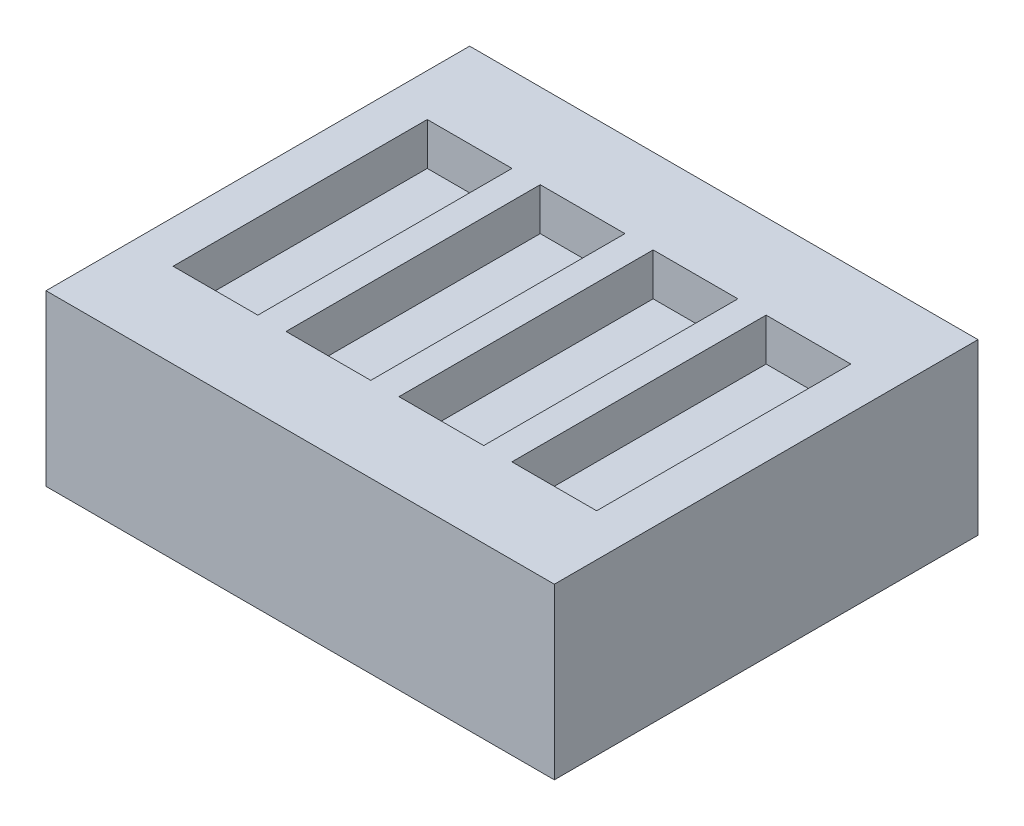
ISO-10303-21;
HEADER;
FILE_DESCRIPTION(('STEP AP214'),'2;1');
FILE_NAME('part.step','',(''),(''),'','','');
FILE_SCHEMA(('AUTOMOTIVE_DESIGN { 1 0 10303 214 1 1 1 1 }'));
ENDSEC;
DATA;
#1=APPLICATION_CONTEXT('core data for automotive mechanical design processes');
#2=APPLICATION_PROTOCOL_DEFINITION('international standard','automotive_design',2000,#1);
#3=PRODUCT_CONTEXT('',#1,'mechanical');
#4=PRODUCT('Part','Part','',(#3));
#5=PRODUCT_RELATED_PRODUCT_CATEGORY('part','',(#4));
#6=PRODUCT_DEFINITION_FORMATION('','',#4);
#7=PRODUCT_DEFINITION_CONTEXT('part definition',#1,'design');
#8=PRODUCT_DEFINITION('design','',#6,#7);
#9=PRODUCT_DEFINITION_SHAPE('','',#8);
#10=(LENGTH_UNIT() NAMED_UNIT(*) SI_UNIT(.MILLI.,.METRE.));
#11=(NAMED_UNIT(*) PLANE_ANGLE_UNIT() SI_UNIT($,.RADIAN.));
#12=(NAMED_UNIT(*) SI_UNIT($,.STERADIAN.) SOLID_ANGLE_UNIT());
#13=UNCERTAINTY_MEASURE_WITH_UNIT(LENGTH_MEASURE(1.E-05),#10,'distance_accuracy_value','');
#14=(GEOMETRIC_REPRESENTATION_CONTEXT(3) GLOBAL_UNCERTAINTY_ASSIGNED_CONTEXT((#13)) GLOBAL_UNIT_ASSIGNED_CONTEXT((#10,
#11,#12)) REPRESENTATION_CONTEXT('',''));
#15=CARTESIAN_POINT('',(0.,0.,0.));
#16=DIRECTION('',(0.,0.,1.));
#17=DIRECTION('',(1.,0.,0.));
#18=AXIS2_PLACEMENT_3D('',#15,#16,#17);
#19=CARTESIAN_POINT('',(0.,2.,0.));
#20=DIRECTION('',(0.,-1.,0.));
#21=DIRECTION('',(0.,0.,-1.));
#22=AXIS2_PLACEMENT_3D('',#19,#20,#21);
#23=PLANE('',#22);
#24=DIRECTION('',(0.,0.,1.));
#25=VECTOR('',#24,1.);
#26=CARTESIAN_POINT('',(1.5,2.,-4.));
#27=LINE('',#26,#25);
#28=CARTESIAN_POINT('',(1.5,2.,-4.));
#29=VERTEX_POINT('',#28);
#30=CARTESIAN_POINT('',(1.5,2.,-1.));
#31=VERTEX_POINT('',#30);
#32=EDGE_CURVE('E206',#29,#31,#27,.T.);
#33=ORIENTED_EDGE('',*,*,#32,.T.);
#34=DIRECTION('',(1.,0.,0.));
#35=VECTOR('',#34,1.);
#36=CARTESIAN_POINT('',(0.5,2.,-1.));
#37=LINE('',#36,#35);
#38=CARTESIAN_POINT('',(0.5,2.,-1.));
#39=VERTEX_POINT('',#38);
#40=EDGE_CURVE('E54',#39,#31,#37,.T.);
#41=ORIENTED_EDGE('',*,*,#40,.F.);
#42=DIRECTION('',(0.,0.,1.));
#43=VECTOR('',#42,1.);
#44=CARTESIAN_POINT('',(0.5,2.,-4.));
#45=LINE('',#44,#43);
#46=CARTESIAN_POINT('',(0.5,2.,-4.));
#47=VERTEX_POINT('',#46);
#48=EDGE_CURVE('E197',#47,#39,#45,.T.);
#49=ORIENTED_EDGE('',*,*,#48,.F.);
#50=DIRECTION('',(1.,0.,0.));
#51=VECTOR('',#50,1.);
#52=CARTESIAN_POINT('',(0.5,2.,-4.));
#53=LINE('',#52,#51);
#54=EDGE_CURVE('E200',#47,#29,#53,.T.);
#55=ORIENTED_EDGE('',*,*,#54,.T.);
#56=EDGE_LOOP('',(#33,#41,#49,#55));
#57=FACE_BOUND('',#56,.T.);
#58=DIRECTION('',(1.,0.,0.));
#59=VECTOR('',#58,1.);
#60=CARTESIAN_POINT('',(3.166,2.,-4.));
#61=LINE('',#60,#59);
#62=CARTESIAN_POINT('',(3.166,2.,-4.));
#63=VERTEX_POINT('',#62);
#64=CARTESIAN_POINT('',(4.166,2.,-4.));
#65=VERTEX_POINT('',#64);
#66=EDGE_CURVE('E219',#63,#65,#61,.T.);
#67=ORIENTED_EDGE('',*,*,#66,.T.);
#68=DIRECTION('',(0.,0.,1.));
#69=VECTOR('',#68,1.);
#70=CARTESIAN_POINT('',(4.166,2.,-4.));
#71=LINE('',#70,#69);
#72=CARTESIAN_POINT('',(4.166,2.,-1.));
#73=VERTEX_POINT('',#72);
#74=EDGE_CURVE('E265',#65,#73,#71,.T.);
#75=ORIENTED_EDGE('',*,*,#74,.T.);
#76=DIRECTION('',(1.,0.,0.));
#77=VECTOR('',#76,1.);
#78=CARTESIAN_POINT('',(3.166,2.,-1.));
#79=LINE('',#78,#77);
#80=CARTESIAN_POINT('',(3.166,2.,-1.));
#81=VERTEX_POINT('',#80);
#82=EDGE_CURVE('E261',#81,#73,#79,.T.);
#83=ORIENTED_EDGE('',*,*,#82,.F.);
#84=DIRECTION('',(0.,0.,1.));
#85=VECTOR('',#84,1.);
#86=CARTESIAN_POINT('',(3.166,2.,-4.));
#87=LINE('',#86,#85);
#88=EDGE_CURVE('E258',#63,#81,#87,.T.);
#89=ORIENTED_EDGE('',*,*,#88,.F.);
#90=EDGE_LOOP('',(#67,#75,#83,#89));
#91=FACE_BOUND('',#90,.T.);
#92=DIRECTION('',(0.,0.,1.));
#93=VECTOR('',#92,1.);
#94=CARTESIAN_POINT('',(0.,2.,0.));
#95=LINE('',#94,#93);
#96=CARTESIAN_POINT('',(0.,2.,-5.));
#97=VERTEX_POINT('',#96);
#98=CARTESIAN_POINT('',(0.,2.,0.));
#99=VERTEX_POINT('',#98);
#100=EDGE_CURVE('E311',#97,#99,#95,.T.);
#101=ORIENTED_EDGE('',*,*,#100,.T.);
#102=DIRECTION('',(1.,0.,0.));
#103=VECTOR('',#102,1.);
#104=CARTESIAN_POINT('',(0.,2.,0.));
#105=LINE('',#104,#103);
#106=CARTESIAN_POINT('',(6.,2.,0.));
#107=VERTEX_POINT('',#106);
#108=EDGE_CURVE('E314',#99,#107,#105,.T.);
#109=ORIENTED_EDGE('',*,*,#108,.T.);
#110=DIRECTION('',(0.,0.,-1.));
#111=VECTOR('',#110,1.);
#112=CARTESIAN_POINT('',(6.,2.,0.));
#113=LINE('',#112,#111);
#114=CARTESIAN_POINT('',(6.,2.,-5.));
#115=VERTEX_POINT('',#114);
#116=EDGE_CURVE('E317',#107,#115,#113,.T.);
#117=ORIENTED_EDGE('',*,*,#116,.T.);
#118=DIRECTION('',(-1.,0.,0.));
#119=VECTOR('',#118,1.);
#120=CARTESIAN_POINT('',(0.,2.,-5.));
#121=LINE('',#120,#119);
#122=EDGE_CURVE('E319',#115,#97,#121,.T.);
#123=ORIENTED_EDGE('',*,*,#122,.T.);
#124=EDGE_LOOP('',(#101,#109,#117,#123));
#125=FACE_BOUND('',#124,.T.);
#126=DIRECTION('',(1.,0.,0.));
#127=VECTOR('',#126,1.);
#128=CARTESIAN_POINT('',(4.499,2.,-4.));
#129=LINE('',#128,#127);
#130=CARTESIAN_POINT('',(4.499,2.,-4.));
#131=VERTEX_POINT('',#130);
#132=CARTESIAN_POINT('',(5.499,2.,-4.));
#133=VERTEX_POINT('',#132);
#134=EDGE_CURVE('E250',#131,#133,#129,.T.);
#135=ORIENTED_EDGE('',*,*,#134,.T.);
#136=DIRECTION('',(0.,0.,1.));
#137=VECTOR('',#136,1.);
#138=CARTESIAN_POINT('',(5.499,2.,-4.));
#139=LINE('',#138,#137);
#140=CARTESIAN_POINT('',(5.499,2.,-1.));
#141=VERTEX_POINT('',#140);
#142=EDGE_CURVE('E297',#133,#141,#139,.T.);
#143=ORIENTED_EDGE('',*,*,#142,.T.);
#144=DIRECTION('',(1.,0.,0.));
#145=VECTOR('',#144,1.);
#146=CARTESIAN_POINT('',(4.499,2.,-1.));
#147=LINE('',#146,#145);
#148=CARTESIAN_POINT('',(4.499,2.,-1.));
#149=VERTEX_POINT('',#148);
#150=EDGE_CURVE('E293',#149,#141,#147,.T.);
#151=ORIENTED_EDGE('',*,*,#150,.F.);
#152=DIRECTION('',(0.,0.,1.));
#153=VECTOR('',#152,1.);
#154=CARTESIAN_POINT('',(4.499,2.,-4.));
#155=LINE('',#154,#153);
#156=EDGE_CURVE('E290',#131,#149,#155,.T.);
#157=ORIENTED_EDGE('',*,*,#156,.F.);
#158=EDGE_LOOP('',(#135,#143,#151,#157));
#159=FACE_BOUND('',#158,.T.);
#160=DIRECTION('',(1.,0.,0.));
#161=VECTOR('',#160,1.);
#162=CARTESIAN_POINT('',(1.833,2.,-4.));
#163=LINE('',#162,#161);
#164=CARTESIAN_POINT('',(1.833,2.,-4.));
#165=VERTEX_POINT('',#164);
#166=CARTESIAN_POINT('',(2.833,2.,-4.));
#167=VERTEX_POINT('',#166);
#168=EDGE_CURVE('E62',#165,#167,#163,.T.);
#169=ORIENTED_EDGE('',*,*,#168,.T.);
#170=DIRECTION('',(0.,0.,1.));
#171=VECTOR('',#170,1.);
#172=CARTESIAN_POINT('',(2.833,2.,-4.));
#173=LINE('',#172,#171);
#174=CARTESIAN_POINT('',(2.833,2.,-1.));
#175=VERTEX_POINT('',#174);
#176=EDGE_CURVE('E233',#167,#175,#173,.T.);
#177=ORIENTED_EDGE('',*,*,#176,.T.);
#178=DIRECTION('',(1.,0.,0.));
#179=VECTOR('',#178,1.);
#180=CARTESIAN_POINT('',(1.833,2.,-1.));
#181=LINE('',#180,#179);
#182=CARTESIAN_POINT('',(1.833,2.,-1.));
#183=VERTEX_POINT('',#182);
#184=EDGE_CURVE('E229',#183,#175,#181,.T.);
#185=ORIENTED_EDGE('',*,*,#184,.F.);
#186=DIRECTION('',(0.,0.,1.));
#187=VECTOR('',#186,1.);
#188=CARTESIAN_POINT('',(1.833,2.,-4.));
#189=LINE('',#188,#187);
#190=EDGE_CURVE('E226',#165,#183,#189,.T.);
#191=ORIENTED_EDGE('',*,*,#190,.F.);
#192=EDGE_LOOP('',(#169,#177,#185,#191));
#193=FACE_BOUND('',#192,.T.);
#194=ADVANCED_FACE('F39',(#57,#91,#125,#159,#193),#23,.F.);
#195=CARTESIAN_POINT('',(0.,2.,0.));
#196=DIRECTION('',(1.,0.,0.));
#197=DIRECTION('',(0.,0.,-1.));
#198=AXIS2_PLACEMENT_3D('',#195,#196,#197);
#199=PLANE('',#198);
#200=DIRECTION('',(0.,0.,1.));
#201=VECTOR('',#200,1.);
#202=CARTESIAN_POINT('',(0.,0.,0.));
#203=LINE('',#202,#201);
#204=CARTESIAN_POINT('',(0.,0.,-5.));
#205=VERTEX_POINT('',#204);
#206=CARTESIAN_POINT('',(0.,0.,0.));
#207=VERTEX_POINT('',#206);
#208=EDGE_CURVE('E212',#205,#207,#203,.T.);
#209=ORIENTED_EDGE('',*,*,#208,.T.);
#210=DIRECTION('',(0.,-1.,0.));
#211=VECTOR('',#210,1.);
#212=CARTESIAN_POINT('',(0.,2.,0.));
#213=LINE('',#212,#211);
#214=EDGE_CURVE('E11',#99,#207,#213,.T.);
#215=ORIENTED_EDGE('',*,*,#214,.F.);
#216=ORIENTED_EDGE('',*,*,#100,.F.);
#217=DIRECTION('',(0.,-1.,0.));
#218=VECTOR('',#217,1.);
#219=CARTESIAN_POINT('',(0.,2.,-5.));
#220=LINE('',#219,#218);
#221=EDGE_CURVE('E321',#97,#205,#220,.T.);
#222=ORIENTED_EDGE('',*,*,#221,.T.);
#223=EDGE_LOOP('',(#209,#215,#216,#222));
#224=FACE_BOUND('',#223,.T.);
#225=ADVANCED_FACE('F41',(#224),#199,.F.);
#226=CARTESIAN_POINT('',(0.,2.,0.));
#227=DIRECTION('',(0.,0.,-1.));
#228=DIRECTION('',(-1.,0.,0.));
#229=AXIS2_PLACEMENT_3D('',#226,#227,#228);
#230=PLANE('',#229);
#231=DIRECTION('',(1.,0.,0.));
#232=VECTOR('',#231,1.);
#233=CARTESIAN_POINT('',(0.,0.,0.));
#234=LINE('',#233,#232);
#235=CARTESIAN_POINT('',(6.,0.,0.));
#236=VERTEX_POINT('',#235);
#237=EDGE_CURVE('E324',#207,#236,#234,.T.);
#238=ORIENTED_EDGE('',*,*,#237,.T.);
#239=DIRECTION('',(0.,-1.,0.));
#240=VECTOR('',#239,1.);
#241=CARTESIAN_POINT('',(6.,2.,0.));
#242=LINE('',#241,#240);
#243=EDGE_CURVE('E47',#107,#236,#242,.T.);
#244=ORIENTED_EDGE('',*,*,#243,.F.);
#245=ORIENTED_EDGE('',*,*,#108,.F.);
#246=ORIENTED_EDGE('',*,*,#214,.T.);
#247=EDGE_LOOP('',(#238,#244,#245,#246));
#248=FACE_BOUND('',#247,.T.);
#249=ADVANCED_FACE('F354',(#248),#230,.F.);
#250=CARTESIAN_POINT('',(6.,2.,0.));
#251=DIRECTION('',(-1.,0.,0.));
#252=DIRECTION('',(0.,0.,1.));
#253=AXIS2_PLACEMENT_3D('',#250,#251,#252);
#254=PLANE('',#253);
#255=DIRECTION('',(0.,0.,-1.));
#256=VECTOR('',#255,1.);
#257=CARTESIAN_POINT('',(6.,0.,0.));
#258=LINE('',#257,#256);
#259=CARTESIAN_POINT('',(6.,0.,-5.));
#260=VERTEX_POINT('',#259);
#261=EDGE_CURVE('E326',#236,#260,#258,.T.);
#262=ORIENTED_EDGE('',*,*,#261,.T.);
#263=DIRECTION('',(0.,-1.,0.));
#264=VECTOR('',#263,1.);
#265=CARTESIAN_POINT('',(6.,2.,-5.));
#266=LINE('',#265,#264);
#267=EDGE_CURVE('E331',#115,#260,#266,.T.);
#268=ORIENTED_EDGE('',*,*,#267,.F.);
#269=ORIENTED_EDGE('',*,*,#116,.F.);
#270=ORIENTED_EDGE('',*,*,#243,.T.);
#271=EDGE_LOOP('',(#262,#268,#269,#270));
#272=FACE_BOUND('',#271,.T.);
#273=ADVANCED_FACE('F338',(#272),#254,.F.);
#274=CARTESIAN_POINT('',(0.,2.,-5.));
#275=DIRECTION('',(0.,0.,1.));
#276=DIRECTION('',(1.,0.,0.));
#277=AXIS2_PLACEMENT_3D('',#274,#275,#276);
#278=PLANE('',#277);
#279=DIRECTION('',(-1.,0.,0.));
#280=VECTOR('',#279,1.);
#281=CARTESIAN_POINT('',(0.,0.,-5.));
#282=LINE('',#281,#280);
#283=EDGE_CURVE('E315',#260,#205,#282,.T.);
#284=ORIENTED_EDGE('',*,*,#283,.T.);
#285=ORIENTED_EDGE('',*,*,#221,.F.);
#286=ORIENTED_EDGE('',*,*,#122,.F.);
#287=ORIENTED_EDGE('',*,*,#267,.T.);
#288=EDGE_LOOP('',(#284,#285,#286,#287));
#289=FACE_BOUND('',#288,.T.);
#290=ADVANCED_FACE('F347',(#289),#278,.F.);
#291=CARTESIAN_POINT('',(0.,0.,0.));
#292=DIRECTION('',(0.,-1.,0.));
#293=DIRECTION('',(0.,0.,-1.));
#294=AXIS2_PLACEMENT_3D('',#291,#292,#293);
#295=PLANE('',#294);
#296=ORIENTED_EDGE('',*,*,#208,.F.);
#297=ORIENTED_EDGE('',*,*,#283,.F.);
#298=ORIENTED_EDGE('',*,*,#261,.F.);
#299=ORIENTED_EDGE('',*,*,#237,.F.);
#300=EDGE_LOOP('',(#296,#297,#298,#299));
#301=FACE_BOUND('',#300,.T.);
#302=ADVANCED_FACE('F344',(#301),#295,.T.);
#303=CARTESIAN_POINT('',(4.499,1.5,-4.));
#304=DIRECTION('',(0.,0.,1.));
#305=DIRECTION('',(1.,0.,0.));
#306=AXIS2_PLACEMENT_3D('',#303,#304,#305);
#307=PLANE('',#306);
#308=ORIENTED_EDGE('',*,*,#134,.F.);
#309=DIRECTION('',(0.,1.,0.));
#310=VECTOR('',#309,1.);
#311=CARTESIAN_POINT('',(4.499,1.5,-4.));
#312=LINE('',#311,#310);
#313=CARTESIAN_POINT('',(4.499,1.5,-4.));
#314=VERTEX_POINT('',#313);
#315=EDGE_CURVE('E286',#314,#131,#312,.T.);
#316=ORIENTED_EDGE('',*,*,#315,.F.);
#317=DIRECTION('',(1.,0.,0.));
#318=VECTOR('',#317,1.);
#319=CARTESIAN_POINT('',(4.499,1.5,-4.));
#320=LINE('',#319,#318);
#321=CARTESIAN_POINT('',(5.499,1.5,-4.));
#322=VERTEX_POINT('',#321);
#323=EDGE_CURVE('E294',#314,#322,#320,.T.);
#324=ORIENTED_EDGE('',*,*,#323,.T.);
#325=DIRECTION('',(0.,1.,0.));
#326=VECTOR('',#325,1.);
#327=CARTESIAN_POINT('',(5.499,1.5,-4.));
#328=LINE('',#327,#326);
#329=EDGE_CURVE('E279',#322,#133,#328,.T.);
#330=ORIENTED_EDGE('',*,*,#329,.T.);
#331=EDGE_LOOP('',(#308,#316,#324,#330));
#332=FACE_BOUND('',#331,.T.);
#333=ADVANCED_FACE('F374',(#332),#307,.T.);
#334=CARTESIAN_POINT('',(5.499,1.5,-4.));
#335=DIRECTION('',(-1.,0.,0.));
#336=DIRECTION('',(0.,0.,1.));
#337=AXIS2_PLACEMENT_3D('',#334,#335,#336);
#338=PLANE('',#337);
#339=ORIENTED_EDGE('',*,*,#142,.F.);
#340=ORIENTED_EDGE('',*,*,#329,.F.);
#341=DIRECTION('',(0.,0.,1.));
#342=VECTOR('',#341,1.);
#343=CARTESIAN_POINT('',(5.499,1.5,-4.));
#344=LINE('',#343,#342);
#345=CARTESIAN_POINT('',(5.499,1.5,-1.));
#346=VERTEX_POINT('',#345);
#347=EDGE_CURVE('E307',#322,#346,#344,.T.);
#348=ORIENTED_EDGE('',*,*,#347,.T.);
#349=DIRECTION('',(0.,1.,0.));
#350=VECTOR('',#349,1.);
#351=CARTESIAN_POINT('',(5.499,1.5,-1.));
#352=LINE('',#351,#350);
#353=EDGE_CURVE('E282',#346,#141,#352,.T.);
#354=ORIENTED_EDGE('',*,*,#353,.T.);
#355=EDGE_LOOP('',(#339,#340,#348,#354));
#356=FACE_BOUND('',#355,.T.);
#357=ADVANCED_FACE('F398',(#356),#338,.T.);
#358=CARTESIAN_POINT('',(4.499,1.5,-1.));
#359=DIRECTION('',(0.,0.,1.));
#360=DIRECTION('',(1.,0.,0.));
#361=AXIS2_PLACEMENT_3D('',#358,#359,#360);
#362=PLANE('',#361);
#363=ORIENTED_EDGE('',*,*,#150,.T.);
#364=ORIENTED_EDGE('',*,*,#353,.F.);
#365=DIRECTION('',(1.,0.,0.));
#366=VECTOR('',#365,1.);
#367=CARTESIAN_POINT('',(4.499,1.5,-1.));
#368=LINE('',#367,#366);
#369=CARTESIAN_POINT('',(4.499,1.5,-1.));
#370=VERTEX_POINT('',#369);
#371=EDGE_CURVE('E304',#370,#346,#368,.T.);
#372=ORIENTED_EDGE('',*,*,#371,.F.);
#373=DIRECTION('',(0.,1.,0.));
#374=VECTOR('',#373,1.);
#375=CARTESIAN_POINT('',(4.499,1.5,-1.));
#376=LINE('',#375,#374);
#377=EDGE_CURVE('E284',#370,#149,#376,.T.);
#378=ORIENTED_EDGE('',*,*,#377,.T.);
#379=EDGE_LOOP('',(#363,#364,#372,#378));
#380=FACE_BOUND('',#379,.T.);
#381=ADVANCED_FACE('F408',(#380),#362,.F.);
#382=CARTESIAN_POINT('',(4.499,1.5,-4.));
#383=DIRECTION('',(-1.,0.,0.));
#384=DIRECTION('',(0.,0.,1.));
#385=AXIS2_PLACEMENT_3D('',#382,#383,#384);
#386=PLANE('',#385);
#387=ORIENTED_EDGE('',*,*,#156,.T.);
#388=ORIENTED_EDGE('',*,*,#377,.F.);
#389=DIRECTION('',(0.,0.,1.));
#390=VECTOR('',#389,1.);
#391=CARTESIAN_POINT('',(4.499,1.5,-4.));
#392=LINE('',#391,#390);
#393=EDGE_CURVE('E289',#314,#370,#392,.T.);
#394=ORIENTED_EDGE('',*,*,#393,.F.);
#395=ORIENTED_EDGE('',*,*,#315,.T.);
#396=EDGE_LOOP('',(#387,#388,#394,#395));
#397=FACE_BOUND('',#396,.T.);
#398=ADVANCED_FACE('F418',(#397),#386,.F.);
#399=CARTESIAN_POINT('',(0.,1.5,0.));
#400=DIRECTION('',(0.,-1.,0.));
#401=DIRECTION('',(0.,0.,-1.));
#402=AXIS2_PLACEMENT_3D('',#399,#400,#401);
#403=PLANE('',#402);
#404=ORIENTED_EDGE('',*,*,#323,.F.);
#405=ORIENTED_EDGE('',*,*,#393,.T.);
#406=ORIENTED_EDGE('',*,*,#371,.T.);
#407=ORIENTED_EDGE('',*,*,#347,.F.);
#408=EDGE_LOOP('',(#404,#405,#406,#407));
#409=FACE_BOUND('',#408,.T.);
#410=ADVANCED_FACE('F371',(#409),#403,.F.);
#411=CARTESIAN_POINT('',(3.166,1.5,-4.));
#412=DIRECTION('',(0.,0.,1.));
#413=DIRECTION('',(1.,0.,0.));
#414=AXIS2_PLACEMENT_3D('',#411,#412,#413);
#415=PLANE('',#414);
#416=ORIENTED_EDGE('',*,*,#66,.F.);
#417=DIRECTION('',(0.,1.,0.));
#418=VECTOR('',#417,1.);
#419=CARTESIAN_POINT('',(3.166,1.5,-4.));
#420=LINE('',#419,#418);
#421=CARTESIAN_POINT('',(3.166,1.5,-4.));
#422=VERTEX_POINT('',#421);
#423=EDGE_CURVE('E254',#422,#63,#420,.T.);
#424=ORIENTED_EDGE('',*,*,#423,.F.);
#425=DIRECTION('',(1.,0.,0.));
#426=VECTOR('',#425,1.);
#427=CARTESIAN_POINT('',(3.166,1.5,-4.));
#428=LINE('',#427,#426);
#429=CARTESIAN_POINT('',(4.166,1.5,-4.));
#430=VERTEX_POINT('',#429);
#431=EDGE_CURVE('E262',#422,#430,#428,.T.);
#432=ORIENTED_EDGE('',*,*,#431,.T.);
#433=DIRECTION('',(0.,1.,0.));
#434=VECTOR('',#433,1.);
#435=CARTESIAN_POINT('',(4.166,1.5,-4.));
#436=LINE('',#435,#434);
#437=EDGE_CURVE('E246',#430,#65,#436,.T.);
#438=ORIENTED_EDGE('',*,*,#437,.T.);
#439=EDGE_LOOP('',(#416,#424,#432,#438));
#440=FACE_BOUND('',#439,.T.);
#441=ADVANCED_FACE('F436',(#440),#415,.T.);
#442=CARTESIAN_POINT('',(4.166,1.5,-4.));
#443=DIRECTION('',(-1.,0.,0.));
#444=DIRECTION('',(0.,0.,1.));
#445=AXIS2_PLACEMENT_3D('',#442,#443,#444);
#446=PLANE('',#445);
#447=ORIENTED_EDGE('',*,*,#74,.F.);
#448=ORIENTED_EDGE('',*,*,#437,.F.);
#449=DIRECTION('',(0.,0.,1.));
#450=VECTOR('',#449,1.);
#451=CARTESIAN_POINT('',(4.166,1.5,-4.));
#452=LINE('',#451,#450);
#453=CARTESIAN_POINT('',(4.166,1.5,-1.));
#454=VERTEX_POINT('',#453);
#455=EDGE_CURVE('E275',#430,#454,#452,.T.);
#456=ORIENTED_EDGE('',*,*,#455,.T.);
#457=DIRECTION('',(0.,1.,0.));
#458=VECTOR('',#457,1.);
#459=CARTESIAN_POINT('',(4.166,1.5,-1.));
#460=LINE('',#459,#458);
#461=EDGE_CURVE('E249',#454,#73,#460,.T.);
#462=ORIENTED_EDGE('',*,*,#461,.T.);
#463=EDGE_LOOP('',(#447,#448,#456,#462));
#464=FACE_BOUND('',#463,.T.);
#465=ADVANCED_FACE('F445',(#464),#446,.T.);
#466=CARTESIAN_POINT('',(3.166,1.5,-1.));
#467=DIRECTION('',(0.,0.,1.));
#468=DIRECTION('',(1.,0.,0.));
#469=AXIS2_PLACEMENT_3D('',#466,#467,#468);
#470=PLANE('',#469);
#471=ORIENTED_EDGE('',*,*,#82,.T.);
#472=ORIENTED_EDGE('',*,*,#461,.F.);
#473=DIRECTION('',(1.,0.,0.));
#474=VECTOR('',#473,1.);
#475=CARTESIAN_POINT('',(3.166,1.5,-1.));
#476=LINE('',#475,#474);
#477=CARTESIAN_POINT('',(3.166,1.5,-1.));
#478=VERTEX_POINT('',#477);
#479=EDGE_CURVE('E272',#478,#454,#476,.T.);
#480=ORIENTED_EDGE('',*,*,#479,.F.);
#481=DIRECTION('',(0.,1.,0.));
#482=VECTOR('',#481,1.);
#483=CARTESIAN_POINT('',(3.166,1.5,-1.));
#484=LINE('',#483,#482);
#485=EDGE_CURVE('E252',#478,#81,#484,.T.);
#486=ORIENTED_EDGE('',*,*,#485,.T.);
#487=EDGE_LOOP('',(#471,#472,#480,#486));
#488=FACE_BOUND('',#487,.T.);
#489=ADVANCED_FACE('F455',(#488),#470,.F.);
#490=CARTESIAN_POINT('',(3.166,1.5,-4.));
#491=DIRECTION('',(-1.,0.,0.));
#492=DIRECTION('',(0.,0.,1.));
#493=AXIS2_PLACEMENT_3D('',#490,#491,#492);
#494=PLANE('',#493);
#495=ORIENTED_EDGE('',*,*,#88,.T.);
#496=ORIENTED_EDGE('',*,*,#485,.F.);
#497=DIRECTION('',(0.,0.,1.));
#498=VECTOR('',#497,1.);
#499=CARTESIAN_POINT('',(3.166,1.5,-4.));
#500=LINE('',#499,#498);
#501=EDGE_CURVE('E257',#422,#478,#500,.T.);
#502=ORIENTED_EDGE('',*,*,#501,.F.);
#503=ORIENTED_EDGE('',*,*,#423,.T.);
#504=EDGE_LOOP('',(#495,#496,#502,#503));
#505=FACE_BOUND('',#504,.T.);
#506=ADVANCED_FACE('F465',(#505),#494,.F.);
#507=CARTESIAN_POINT('',(0.,1.5,0.));
#508=DIRECTION('',(0.,-1.,0.));
#509=DIRECTION('',(0.,0.,-1.));
#510=AXIS2_PLACEMENT_3D('',#507,#508,#509);
#511=PLANE('',#510);
#512=ORIENTED_EDGE('',*,*,#431,.F.);
#513=ORIENTED_EDGE('',*,*,#501,.T.);
#514=ORIENTED_EDGE('',*,*,#479,.T.);
#515=ORIENTED_EDGE('',*,*,#455,.F.);
#516=EDGE_LOOP('',(#512,#513,#514,#515));
#517=FACE_BOUND('',#516,.T.);
#518=ADVANCED_FACE('F475',(#517),#511,.F.);
#519=CARTESIAN_POINT('',(1.833,1.5,-4.));
#520=DIRECTION('',(0.,0.,1.));
#521=DIRECTION('',(1.,0.,0.));
#522=AXIS2_PLACEMENT_3D('',#519,#520,#521);
#523=PLANE('',#522);
#524=ORIENTED_EDGE('',*,*,#168,.F.);
#525=DIRECTION('',(0.,1.,0.));
#526=VECTOR('',#525,1.);
#527=CARTESIAN_POINT('',(1.833,1.5,-4.));
#528=LINE('',#527,#526);
#529=CARTESIAN_POINT('',(1.833,1.5,-4.));
#530=VERTEX_POINT('',#529);
#531=EDGE_CURVE('E223',#530,#165,#528,.T.);
#532=ORIENTED_EDGE('',*,*,#531,.F.);
#533=DIRECTION('',(1.,0.,0.));
#534=VECTOR('',#533,1.);
#535=CARTESIAN_POINT('',(1.833,1.5,-4.));
#536=LINE('',#535,#534);
#537=CARTESIAN_POINT('',(2.833,1.5,-4.));
#538=VERTEX_POINT('',#537);
#539=EDGE_CURVE('E230',#530,#538,#536,.T.);
#540=ORIENTED_EDGE('',*,*,#539,.T.);
#541=DIRECTION('',(0.,1.,0.));
#542=VECTOR('',#541,1.);
#543=CARTESIAN_POINT('',(2.833,1.5,-4.));
#544=LINE('',#543,#542);
#545=EDGE_CURVE('E216',#538,#167,#544,.T.);
#546=ORIENTED_EDGE('',*,*,#545,.T.);
#547=EDGE_LOOP('',(#524,#532,#540,#546));
#548=FACE_BOUND('',#547,.T.);
#549=ADVANCED_FACE('F485',(#548),#523,.T.);
#550=CARTESIAN_POINT('',(2.833,1.5,-4.));
#551=DIRECTION('',(-1.,0.,0.));
#552=DIRECTION('',(0.,0.,1.));
#553=AXIS2_PLACEMENT_3D('',#550,#551,#552);
#554=PLANE('',#553);
#555=ORIENTED_EDGE('',*,*,#176,.F.);
#556=ORIENTED_EDGE('',*,*,#545,.F.);
#557=DIRECTION('',(0.,0.,1.));
#558=VECTOR('',#557,1.);
#559=CARTESIAN_POINT('',(2.833,1.5,-4.));
#560=LINE('',#559,#558);
#561=CARTESIAN_POINT('',(2.833,1.5,-1.));
#562=VERTEX_POINT('',#561);
#563=EDGE_CURVE('E242',#538,#562,#560,.T.);
#564=ORIENTED_EDGE('',*,*,#563,.T.);
#565=DIRECTION('',(0.,1.,0.));
#566=VECTOR('',#565,1.);
#567=CARTESIAN_POINT('',(2.833,1.5,-1.));
#568=LINE('',#567,#566);
#569=EDGE_CURVE('E218',#562,#175,#568,.T.);
#570=ORIENTED_EDGE('',*,*,#569,.T.);
#571=EDGE_LOOP('',(#555,#556,#564,#570));
#572=FACE_BOUND('',#571,.T.);
#573=ADVANCED_FACE('F495',(#572),#554,.T.);
#574=CARTESIAN_POINT('',(1.833,1.5,-1.));
#575=DIRECTION('',(0.,0.,1.));
#576=DIRECTION('',(1.,0.,0.));
#577=AXIS2_PLACEMENT_3D('',#574,#575,#576);
#578=PLANE('',#577);
#579=ORIENTED_EDGE('',*,*,#184,.T.);
#580=ORIENTED_EDGE('',*,*,#569,.F.);
#581=DIRECTION('',(1.,0.,0.));
#582=VECTOR('',#581,1.);
#583=CARTESIAN_POINT('',(1.833,1.5,-1.));
#584=LINE('',#583,#582);
#585=CARTESIAN_POINT('',(1.833,1.5,-1.));
#586=VERTEX_POINT('',#585);
#587=EDGE_CURVE('E239',#586,#562,#584,.T.);
#588=ORIENTED_EDGE('',*,*,#587,.F.);
#589=DIRECTION('',(0.,1.,0.));
#590=VECTOR('',#589,1.);
#591=CARTESIAN_POINT('',(1.833,1.5,-1.));
#592=LINE('',#591,#590);
#593=EDGE_CURVE('E221',#586,#183,#592,.T.);
#594=ORIENTED_EDGE('',*,*,#593,.T.);
#595=EDGE_LOOP('',(#579,#580,#588,#594));
#596=FACE_BOUND('',#595,.T.);
#597=ADVANCED_FACE('F504',(#596),#578,.F.);
#598=CARTESIAN_POINT('',(1.833,1.5,-4.));
#599=DIRECTION('',(-1.,0.,0.));
#600=DIRECTION('',(0.,0.,1.));
#601=AXIS2_PLACEMENT_3D('',#598,#599,#600);
#602=PLANE('',#601);
#603=ORIENTED_EDGE('',*,*,#190,.T.);
#604=ORIENTED_EDGE('',*,*,#593,.F.);
#605=DIRECTION('',(0.,0.,1.));
#606=VECTOR('',#605,1.);
#607=CARTESIAN_POINT('',(1.833,1.5,-4.));
#608=LINE('',#607,#606);
#609=EDGE_CURVE('E225',#530,#586,#608,.T.);
#610=ORIENTED_EDGE('',*,*,#609,.F.);
#611=ORIENTED_EDGE('',*,*,#531,.T.);
#612=EDGE_LOOP('',(#603,#604,#610,#611));
#613=FACE_BOUND('',#612,.T.);
#614=ADVANCED_FACE('F514',(#613),#602,.F.);
#615=CARTESIAN_POINT('',(0.,1.5,0.));
#616=DIRECTION('',(0.,-1.,0.));
#617=DIRECTION('',(0.,0.,-1.));
#618=AXIS2_PLACEMENT_3D('',#615,#616,#617);
#619=PLANE('',#618);
#620=ORIENTED_EDGE('',*,*,#539,.F.);
#621=ORIENTED_EDGE('',*,*,#609,.T.);
#622=ORIENTED_EDGE('',*,*,#587,.T.);
#623=ORIENTED_EDGE('',*,*,#563,.F.);
#624=EDGE_LOOP('',(#620,#621,#622,#623));
#625=FACE_BOUND('',#624,.T.);
#626=ADVANCED_FACE('F524',(#625),#619,.F.);
#627=CARTESIAN_POINT('',(0.5,1.5,-1.));
#628=DIRECTION('',(0.,0.,1.));
#629=DIRECTION('',(1.,0.,0.));
#630=AXIS2_PLACEMENT_3D('',#627,#628,#629);
#631=PLANE('',#630);
#632=ORIENTED_EDGE('',*,*,#40,.T.);
#633=DIRECTION('',(0.,1.,0.));
#634=VECTOR('',#633,1.);
#635=CARTESIAN_POINT('',(1.5,1.5,-1.));
#636=LINE('',#635,#634);
#637=CARTESIAN_POINT('',(1.5,1.5,-1.));
#638=VERTEX_POINT('',#637);
#639=EDGE_CURVE('E181',#638,#31,#636,.T.);
#640=ORIENTED_EDGE('',*,*,#639,.F.);
#641=DIRECTION('',(1.,0.,0.));
#642=VECTOR('',#641,1.);
#643=CARTESIAN_POINT('',(0.5,1.5,-1.));
#644=LINE('',#643,#642);
#645=CARTESIAN_POINT('',(0.5,1.5,-1.));
#646=VERTEX_POINT('',#645);
#647=EDGE_CURVE('E188',#646,#638,#644,.T.);
#648=ORIENTED_EDGE('',*,*,#647,.F.);
#649=DIRECTION('',(0.,1.,0.));
#650=VECTOR('',#649,1.);
#651=CARTESIAN_POINT('',(0.5,1.5,-1.));
#652=LINE('',#651,#650);
#653=EDGE_CURVE('E210',#646,#39,#652,.T.);
#654=ORIENTED_EDGE('',*,*,#653,.T.);
#655=EDGE_LOOP('',(#632,#640,#648,#654));
#656=FACE_BOUND('',#655,.T.);
#657=ADVANCED_FACE('F191',(#656),#631,.F.);
#658=CARTESIAN_POINT('',(0.5,1.5,-4.));
#659=DIRECTION('',(-1.,0.,0.));
#660=DIRECTION('',(0.,0.,1.));
#661=AXIS2_PLACEMENT_3D('',#658,#659,#660);
#662=PLANE('',#661);
#663=ORIENTED_EDGE('',*,*,#48,.T.);
#664=ORIENTED_EDGE('',*,*,#653,.F.);
#665=DIRECTION('',(0.,0.,1.));
#666=VECTOR('',#665,1.);
#667=CARTESIAN_POINT('',(0.5,1.5,-4.));
#668=LINE('',#667,#666);
#669=CARTESIAN_POINT('',(0.5,1.5,-4.));
#670=VERTEX_POINT('',#669);
#671=EDGE_CURVE('E193',#670,#646,#668,.T.);
#672=ORIENTED_EDGE('',*,*,#671,.F.);
#673=DIRECTION('',(0.,1.,0.));
#674=VECTOR('',#673,1.);
#675=CARTESIAN_POINT('',(0.5,1.5,-4.));
#676=LINE('',#675,#674);
#677=EDGE_CURVE('E213',#670,#47,#676,.T.);
#678=ORIENTED_EDGE('',*,*,#677,.T.);
#679=EDGE_LOOP('',(#663,#664,#672,#678));
#680=FACE_BOUND('',#679,.T.);
#681=ADVANCED_FACE('F543',(#680),#662,.F.);
#682=CARTESIAN_POINT('',(0.5,1.5,-4.));
#683=DIRECTION('',(0.,0.,1.));
#684=DIRECTION('',(1.,0.,0.));
#685=AXIS2_PLACEMENT_3D('',#682,#683,#684);
#686=PLANE('',#685);
#687=ORIENTED_EDGE('',*,*,#54,.F.);
#688=ORIENTED_EDGE('',*,*,#677,.F.);
#689=DIRECTION('',(1.,0.,0.));
#690=VECTOR('',#689,1.);
#691=CARTESIAN_POINT('',(0.5,1.5,-4.));
#692=LINE('',#691,#690);
#693=CARTESIAN_POINT('',(1.5,1.5,-4.));
#694=VERTEX_POINT('',#693);
#695=EDGE_CURVE('E187',#670,#694,#692,.T.);
#696=ORIENTED_EDGE('',*,*,#695,.T.);
#697=DIRECTION('',(0.,1.,0.));
#698=VECTOR('',#697,1.);
#699=CARTESIAN_POINT('',(1.5,1.5,-4.));
#700=LINE('',#699,#698);
#701=EDGE_CURVE('E183',#694,#29,#700,.T.);
#702=ORIENTED_EDGE('',*,*,#701,.T.);
#703=EDGE_LOOP('',(#687,#688,#696,#702));
#704=FACE_BOUND('',#703,.T.);
#705=ADVANCED_FACE('F552',(#704),#686,.T.);
#706=CARTESIAN_POINT('',(1.5,1.5,-4.));
#707=DIRECTION('',(-1.,0.,0.));
#708=DIRECTION('',(0.,0.,1.));
#709=AXIS2_PLACEMENT_3D('',#706,#707,#708);
#710=PLANE('',#709);
#711=ORIENTED_EDGE('',*,*,#32,.F.);
#712=ORIENTED_EDGE('',*,*,#701,.F.);
#713=DIRECTION('',(0.,0.,1.));
#714=VECTOR('',#713,1.);
#715=CARTESIAN_POINT('',(1.5,1.5,-4.));
#716=LINE('',#715,#714);
#717=EDGE_CURVE('E178',#694,#638,#716,.T.);
#718=ORIENTED_EDGE('',*,*,#717,.T.);
#719=ORIENTED_EDGE('',*,*,#639,.T.);
#720=EDGE_LOOP('',(#711,#712,#718,#719));
#721=FACE_BOUND('',#720,.T.);
#722=ADVANCED_FACE('F180',(#721),#710,.T.);
#723=CARTESIAN_POINT('',(0.,1.5,0.));
#724=DIRECTION('',(0.,-1.,0.));
#725=DIRECTION('',(0.,0.,-1.));
#726=AXIS2_PLACEMENT_3D('',#723,#724,#725);
#727=PLANE('',#726);
#728=ORIENTED_EDGE('',*,*,#647,.T.);
#729=ORIENTED_EDGE('',*,*,#717,.F.);
#730=ORIENTED_EDGE('',*,*,#695,.F.);
#731=ORIENTED_EDGE('',*,*,#671,.T.);
#732=EDGE_LOOP('',(#728,#729,#730,#731));
#733=FACE_BOUND('',#732,.T.);
#734=ADVANCED_FACE('F195',(#733),#727,.F.);
#735=CLOSED_SHELL('',(#194,#225,#249,#273,#290,#302,#333,#357,#381,#398,#410,#441,#465,#489,
#506,#518,#549,#573,#597,#614,#626,#657,#681,#705,#722,#734));
#736=MANIFOLD_SOLID_BREP('B2',#735);
#737=ADVANCED_BREP_SHAPE_REPRESENTATION('',(#18,#736),#14);
#738=SHAPE_DEFINITION_REPRESENTATION(#9,#737);
ENDSEC;
END-ISO-10303-21;
